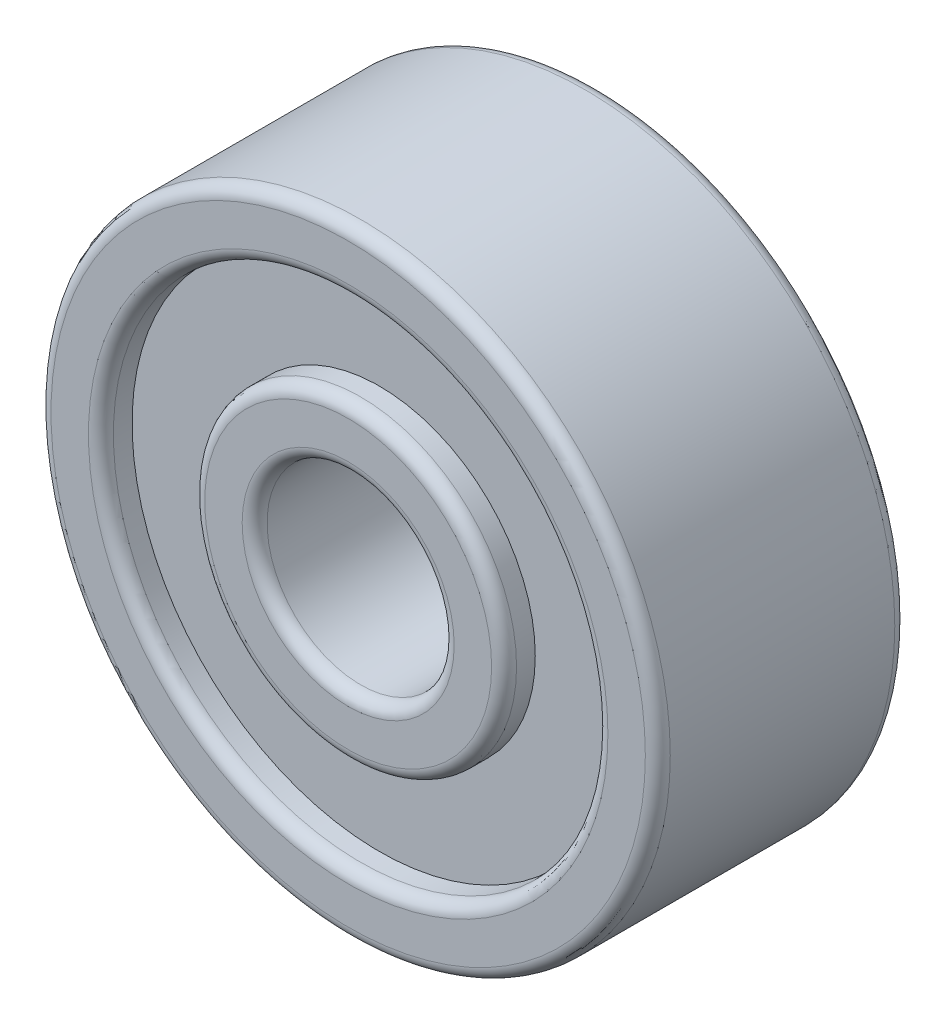
ISO-10303-21;
HEADER;
FILE_DESCRIPTION(('STEP AP214'),'2;1');
FILE_NAME('part.step','',(''),(''),'','','');
FILE_SCHEMA(('AUTOMOTIVE_DESIGN { 1 0 10303 214 1 1 1 1 }'));
ENDSEC;
DATA;
#1=APPLICATION_CONTEXT('core data for automotive mechanical design processes');
#2=APPLICATION_PROTOCOL_DEFINITION('international standard','automotive_design',2000,#1);
#3=PRODUCT_CONTEXT('',#1,'mechanical');
#4=PRODUCT('Part','Part','',(#3));
#5=PRODUCT_RELATED_PRODUCT_CATEGORY('part','',(#4));
#6=PRODUCT_DEFINITION_FORMATION('','',#4);
#7=PRODUCT_DEFINITION_CONTEXT('part definition',#1,'design');
#8=PRODUCT_DEFINITION('design','',#6,#7);
#9=PRODUCT_DEFINITION_SHAPE('','',#8);
#10=(LENGTH_UNIT() NAMED_UNIT(*) SI_UNIT(.MILLI.,.METRE.));
#11=(NAMED_UNIT(*) PLANE_ANGLE_UNIT() SI_UNIT($,.RADIAN.));
#12=(NAMED_UNIT(*) SI_UNIT($,.STERADIAN.) SOLID_ANGLE_UNIT());
#13=UNCERTAINTY_MEASURE_WITH_UNIT(LENGTH_MEASURE(1.E-05),#10,'distance_accuracy_value','');
#14=(GEOMETRIC_REPRESENTATION_CONTEXT(3) GLOBAL_UNCERTAINTY_ASSIGNED_CONTEXT((#13)) GLOBAL_UNIT_ASSIGNED_CONTEXT((#10,
#11,#12)) REPRESENTATION_CONTEXT('',''));
#15=CARTESIAN_POINT('',(0.,0.,0.));
#16=DIRECTION('',(0.,0.,1.));
#17=DIRECTION('',(1.,0.,0.));
#18=AXIS2_PLACEMENT_3D('',#15,#16,#17);
#19=CARTESIAN_POINT('',(0.,0.,2.));
#20=DIRECTION('',(0.,0.,1.));
#21=DIRECTION('',(1.,0.,0.));
#22=AXIS2_PLACEMENT_3D('',#19,#20,#21);
#23=PLANE('',#22);
#24=CARTESIAN_POINT('',(0.,0.,2.));
#25=DIRECTION('',(0.,0.,1.));
#26=DIRECTION('',(1.,0.,0.));
#27=AXIS2_PLACEMENT_3D('',#24,#25,#26);
#28=CIRCLE('',#27,1.7);
#29=CARTESIAN_POINT('',(1.7,0.,2.));
#30=VERTEX_POINT('',#29);
#31=EDGE_CURVE('E55',#30,#30,#28,.F.);
#32=ORIENTED_EDGE('',*,*,#31,.T.);
#33=EDGE_LOOP('',(#32));
#34=FACE_BOUND('',#33,.T.);
#35=CARTESIAN_POINT('',(0.,0.,2.));
#36=DIRECTION('',(0.,0.,1.));
#37=DIRECTION('',(1.,0.,0.));
#38=AXIS2_PLACEMENT_3D('',#35,#36,#37);
#39=CIRCLE('',#38,2.3);
#40=CARTESIAN_POINT('',(2.3,0.,2.));
#41=VERTEX_POINT('',#40);
#42=EDGE_CURVE('E58',#41,#41,#39,.T.);
#43=ORIENTED_EDGE('',*,*,#42,.T.);
#44=EDGE_LOOP('',(#43));
#45=FACE_BOUND('',#44,.T.);
#46=ADVANCED_FACE('F32',(#34,#45),#23,.T.);
#47=CARTESIAN_POINT('',(0.,0.,2.));
#48=DIRECTION('',(0.,0.,1.));
#49=DIRECTION('',(1.,0.,0.));
#50=AXIS2_PLACEMENT_3D('',#47,#48,#49);
#51=CIRCLE('',#50,4.165);
#52=CARTESIAN_POINT('',(4.165,0.,2.));
#53=VERTEX_POINT('',#52);
#54=EDGE_CURVE('E39',#53,#53,#51,.F.);
#55=ORIENTED_EDGE('',*,*,#54,.T.);
#56=EDGE_LOOP('',(#55));
#57=FACE_BOUND('',#56,.T.);
#58=CARTESIAN_POINT('',(0.,0.,2.));
#59=DIRECTION('',(0.,0.,1.));
#60=DIRECTION('',(1.,0.,0.));
#61=AXIS2_PLACEMENT_3D('',#58,#59,#60);
#62=CIRCLE('',#61,4.765);
#63=CARTESIAN_POINT('',(4.765,0.,2.));
#64=VERTEX_POINT('',#63);
#65=EDGE_CURVE('E43',#64,#64,#62,.T.);
#66=ORIENTED_EDGE('',*,*,#65,.T.);
#67=EDGE_LOOP('',(#66));
#68=FACE_BOUND('',#67,.T.);
#69=ADVANCED_FACE('F120',(#57,#68),#23,.T.);
#70=CARTESIAN_POINT('',(0.,0.,2.));
#71=DIRECTION('',(0.,0.,-1.));
#72=DIRECTION('',(-1.,0.,0.));
#73=AXIS2_PLACEMENT_3D('',#70,#71,#72);
#74=CYLINDRICAL_SURFACE('',#73,4.965);
#75=CARTESIAN_POINT('',(0.,0.,1.8));
#76=DIRECTION('',(0.,0.,1.));
#77=DIRECTION('',(1.,0.,0.));
#78=AXIS2_PLACEMENT_3D('',#75,#76,#77);
#79=CIRCLE('',#78,4.965);
#80=CARTESIAN_POINT('',(4.965,0.,1.8));
#81=VERTEX_POINT('',#80);
#82=EDGE_CURVE('E10',#81,#81,#79,.F.);
#83=ORIENTED_EDGE('',*,*,#82,.T.);
#84=EDGE_LOOP('',(#83));
#85=FACE_BOUND('',#84,.T.);
#86=CARTESIAN_POINT('',(0.,0.,-1.8));
#87=DIRECTION('',(0.,0.,1.));
#88=DIRECTION('',(1.,0.,0.));
#89=AXIS2_PLACEMENT_3D('',#86,#87,#88);
#90=CIRCLE('',#89,4.965);
#91=CARTESIAN_POINT('',(4.965,0.,-1.8));
#92=VERTEX_POINT('',#91);
#93=EDGE_CURVE('E70',#92,#92,#90,.F.);
#94=ORIENTED_EDGE('',*,*,#93,.F.);
#95=EDGE_LOOP('',(#94));
#96=FACE_BOUND('',#95,.T.);
#97=ADVANCED_FACE('F126',(#85,#96),#74,.T.);
#98=CARTESIAN_POINT('',(0.,0.,2.));
#99=DIRECTION('',(0.,0.,-1.));
#100=DIRECTION('',(-1.,0.,0.));
#101=AXIS2_PLACEMENT_3D('',#98,#99,#100);
#102=CYLINDRICAL_SURFACE('',#101,1.5);
#103=CARTESIAN_POINT('',(0.,0.,1.8));
#104=DIRECTION('',(0.,0.,1.));
#105=DIRECTION('',(1.,0.,0.));
#106=AXIS2_PLACEMENT_3D('',#103,#104,#105);
#107=CIRCLE('',#106,1.5);
#108=CARTESIAN_POINT('',(1.5,0.,1.8));
#109=VERTEX_POINT('',#108);
#110=EDGE_CURVE('E61',#109,#109,#107,.T.);
#111=ORIENTED_EDGE('',*,*,#110,.T.);
#112=EDGE_LOOP('',(#111));
#113=FACE_BOUND('',#112,.T.);
#114=CARTESIAN_POINT('',(0.,0.,-1.8));
#115=DIRECTION('',(0.,0.,1.));
#116=DIRECTION('',(1.,0.,0.));
#117=AXIS2_PLACEMENT_3D('',#114,#115,#116);
#118=CIRCLE('',#117,1.5);
#119=CARTESIAN_POINT('',(1.5,0.,-1.8));
#120=VERTEX_POINT('',#119);
#121=EDGE_CURVE('E91',#120,#120,#118,.T.);
#122=ORIENTED_EDGE('',*,*,#121,.F.);
#123=EDGE_LOOP('',(#122));
#124=FACE_BOUND('',#123,.T.);
#125=ADVANCED_FACE('F130',(#113,#124),#102,.F.);
#126=CARTESIAN_POINT('',(0.,0.,1.5));
#127=DIRECTION('',(0.,0.,1.));
#128=DIRECTION('',(1.,0.,0.));
#129=AXIS2_PLACEMENT_3D('',#126,#127,#128);
#130=CYLINDRICAL_SURFACE('',#129,3.965);
#131=CARTESIAN_POINT('',(0.,0.,1.8));
#132=DIRECTION('',(0.,0.,1.));
#133=DIRECTION('',(1.,0.,0.));
#134=AXIS2_PLACEMENT_3D('',#131,#132,#133);
#135=CIRCLE('',#134,3.965);
#136=CARTESIAN_POINT('',(3.965,0.,1.8));
#137=VERTEX_POINT('',#136);
#138=EDGE_CURVE('E47',#137,#137,#135,.T.);
#139=ORIENTED_EDGE('',*,*,#138,.T.);
#140=EDGE_LOOP('',(#139));
#141=FACE_BOUND('',#140,.T.);
#142=CARTESIAN_POINT('',(0.,0.,1.5));
#143=DIRECTION('',(0.,0.,1.));
#144=DIRECTION('',(1.,0.,0.));
#145=AXIS2_PLACEMENT_3D('',#142,#143,#144);
#146=CIRCLE('',#145,3.965);
#147=CARTESIAN_POINT('',(3.965,0.,1.5));
#148=VERTEX_POINT('',#147);
#149=EDGE_CURVE('E64',#148,#148,#146,.T.);
#150=ORIENTED_EDGE('',*,*,#149,.F.);
#151=EDGE_LOOP('',(#150));
#152=FACE_BOUND('',#151,.T.);
#153=ADVANCED_FACE('F153',(#141,#152),#130,.F.);
#154=CARTESIAN_POINT('',(0.,0.,1.5));
#155=DIRECTION('',(0.,0.,1.));
#156=DIRECTION('',(1.,0.,0.));
#157=AXIS2_PLACEMENT_3D('',#154,#155,#156);
#158=PLANE('',#157);
#159=CARTESIAN_POINT('',(0.,0.,1.5));
#160=DIRECTION('',(0.,0.,1.));
#161=DIRECTION('',(1.,0.,0.));
#162=AXIS2_PLACEMENT_3D('',#159,#160,#161);
#163=CIRCLE('',#162,2.5);
#164=CARTESIAN_POINT('',(2.5,0.,1.5));
#165=VERTEX_POINT('',#164);
#166=EDGE_CURVE('E67',#165,#165,#163,.T.);
#167=ORIENTED_EDGE('',*,*,#166,.F.);
#168=EDGE_LOOP('',(#167));
#169=FACE_BOUND('',#168,.T.);
#170=ORIENTED_EDGE('',*,*,#149,.T.);
#171=EDGE_LOOP('',(#170));
#172=FACE_BOUND('',#171,.T.);
#173=ADVANCED_FACE('F156',(#169,#172),#158,.T.);
#174=CARTESIAN_POINT('',(0.,0.,1.5));
#175=DIRECTION('',(0.,0.,1.));
#176=DIRECTION('',(1.,0.,0.));
#177=AXIS2_PLACEMENT_3D('',#174,#175,#176);
#178=CYLINDRICAL_SURFACE('',#177,2.5);
#179=CARTESIAN_POINT('',(0.,0.,1.8));
#180=DIRECTION('',(0.,0.,1.));
#181=DIRECTION('',(1.,0.,0.));
#182=AXIS2_PLACEMENT_3D('',#179,#180,#181);
#183=CIRCLE('',#182,2.5);
#184=CARTESIAN_POINT('',(2.5,0.,1.8));
#185=VERTEX_POINT('',#184);
#186=EDGE_CURVE('E52',#185,#185,#183,.F.);
#187=ORIENTED_EDGE('',*,*,#186,.T.);
#188=EDGE_LOOP('',(#187));
#189=FACE_BOUND('',#188,.T.);
#190=ORIENTED_EDGE('',*,*,#166,.T.);
#191=EDGE_LOOP('',(#190));
#192=FACE_BOUND('',#191,.T.);
#193=ADVANCED_FACE('F138',(#189,#192),#178,.T.);
#194=CARTESIAN_POINT('',(0.,0.,1.8));
#195=DIRECTION('',(0.,0.,1.));
#196=DIRECTION('',(1.,0.,0.));
#197=AXIS2_PLACEMENT_3D('',#194,#195,#196);
#198=TOROIDAL_SURFACE('',#197,1.7,0.2);
#199=ORIENTED_EDGE('',*,*,#31,.F.);
#200=EDGE_LOOP('',(#199));
#201=FACE_BOUND('',#200,.T.);
#202=ORIENTED_EDGE('',*,*,#110,.F.);
#203=EDGE_LOOP('',(#202));
#204=FACE_BOUND('',#203,.T.);
#205=ADVANCED_FACE('F134',(#201,#204),#198,.T.);
#206=CARTESIAN_POINT('',(0.,0.,1.8));
#207=DIRECTION('',(0.,0.,1.));
#208=DIRECTION('',(1.,0.,0.));
#209=AXIS2_PLACEMENT_3D('',#206,#207,#208);
#210=TOROIDAL_SURFACE('',#209,2.3,0.2);
#211=ORIENTED_EDGE('',*,*,#186,.F.);
#212=EDGE_LOOP('',(#211));
#213=FACE_BOUND('',#212,.T.);
#214=ORIENTED_EDGE('',*,*,#42,.F.);
#215=EDGE_LOOP('',(#214));
#216=FACE_BOUND('',#215,.T.);
#217=ADVANCED_FACE('F137',(#213,#216),#210,.T.);
#218=CARTESIAN_POINT('',(0.,0.,1.8));
#219=DIRECTION('',(0.,0.,1.));
#220=DIRECTION('',(1.,0.,0.));
#221=AXIS2_PLACEMENT_3D('',#218,#219,#220);
#222=TOROIDAL_SURFACE('',#221,4.165,0.2);
#223=ORIENTED_EDGE('',*,*,#54,.F.);
#224=EDGE_LOOP('',(#223));
#225=FACE_BOUND('',#224,.T.);
#226=ORIENTED_EDGE('',*,*,#138,.F.);
#227=EDGE_LOOP('',(#226));
#228=FACE_BOUND('',#227,.T.);
#229=ADVANCED_FACE('F141',(#225,#228),#222,.T.);
#230=CARTESIAN_POINT('',(0.,0.,1.8));
#231=DIRECTION('',(0.,0.,1.));
#232=DIRECTION('',(1.,0.,0.));
#233=AXIS2_PLACEMENT_3D('',#230,#231,#232);
#234=TOROIDAL_SURFACE('',#233,4.765,0.2);
#235=ORIENTED_EDGE('',*,*,#82,.F.);
#236=EDGE_LOOP('',(#235));
#237=FACE_BOUND('',#236,.T.);
#238=ORIENTED_EDGE('',*,*,#65,.F.);
#239=EDGE_LOOP('',(#238));
#240=FACE_BOUND('',#239,.T.);
#241=ADVANCED_FACE('F34',(#237,#240),#234,.T.);
#242=CARTESIAN_POINT('',(0.,0.,-2.));
#243=DIRECTION('',(0.,0.,-1.));
#244=DIRECTION('',(1.,0.,0.));
#245=AXIS2_PLACEMENT_3D('',#242,#243,#244);
#246=PLANE('',#245);
#247=CARTESIAN_POINT('',(0.,0.,-2.));
#248=DIRECTION('',(0.,0.,1.));
#249=DIRECTION('',(1.,0.,0.));
#250=AXIS2_PLACEMENT_3D('',#247,#248,#249);
#251=CIRCLE('',#250,1.7);
#252=CARTESIAN_POINT('',(1.7,0.,-2.));
#253=VERTEX_POINT('',#252);
#254=EDGE_CURVE('E85',#253,#253,#251,.F.);
#255=ORIENTED_EDGE('',*,*,#254,.F.);
#256=EDGE_LOOP('',(#255));
#257=FACE_BOUND('',#256,.T.);
#258=CARTESIAN_POINT('',(0.,0.,-2.));
#259=DIRECTION('',(0.,0.,1.));
#260=DIRECTION('',(1.,0.,0.));
#261=AXIS2_PLACEMENT_3D('',#258,#259,#260);
#262=CIRCLE('',#261,2.3);
#263=CARTESIAN_POINT('',(2.3,0.,-2.));
#264=VERTEX_POINT('',#263);
#265=EDGE_CURVE('E88',#264,#264,#262,.T.);
#266=ORIENTED_EDGE('',*,*,#265,.F.);
#267=EDGE_LOOP('',(#266));
#268=FACE_BOUND('',#267,.T.);
#269=ADVANCED_FACE('F148',(#257,#268),#246,.T.);
#270=CARTESIAN_POINT('',(0.,0.,-2.));
#271=DIRECTION('',(0.,0.,1.));
#272=DIRECTION('',(1.,0.,0.));
#273=AXIS2_PLACEMENT_3D('',#270,#271,#272);
#274=CIRCLE('',#273,4.165);
#275=CARTESIAN_POINT('',(4.165,0.,-2.));
#276=VERTEX_POINT('',#275);
#277=EDGE_CURVE('E73',#276,#276,#274,.F.);
#278=ORIENTED_EDGE('',*,*,#277,.F.);
#279=EDGE_LOOP('',(#278));
#280=FACE_BOUND('',#279,.T.);
#281=CARTESIAN_POINT('',(0.,0.,-2.));
#282=DIRECTION('',(0.,0.,1.));
#283=DIRECTION('',(1.,0.,0.));
#284=AXIS2_PLACEMENT_3D('',#281,#282,#283);
#285=CIRCLE('',#284,4.765);
#286=CARTESIAN_POINT('',(4.765,0.,-2.));
#287=VERTEX_POINT('',#286);
#288=EDGE_CURVE('E76',#287,#287,#285,.T.);
#289=ORIENTED_EDGE('',*,*,#288,.F.);
#290=EDGE_LOOP('',(#289));
#291=FACE_BOUND('',#290,.T.);
#292=ADVANCED_FACE('F180',(#280,#291),#246,.T.);
#293=CARTESIAN_POINT('',(0.,0.,-1.5));
#294=DIRECTION('',(0.,0.,-1.));
#295=DIRECTION('',(1.,0.,0.));
#296=AXIS2_PLACEMENT_3D('',#293,#294,#295);
#297=CYLINDRICAL_SURFACE('',#296,3.965);
#298=CARTESIAN_POINT('',(0.,0.,-1.8));
#299=DIRECTION('',(0.,0.,1.));
#300=DIRECTION('',(1.,0.,0.));
#301=AXIS2_PLACEMENT_3D('',#298,#299,#300);
#302=CIRCLE('',#301,3.965);
#303=CARTESIAN_POINT('',(3.965,0.,-1.8));
#304=VERTEX_POINT('',#303);
#305=EDGE_CURVE('E79',#304,#304,#302,.T.);
#306=ORIENTED_EDGE('',*,*,#305,.F.);
#307=EDGE_LOOP('',(#306));
#308=FACE_BOUND('',#307,.T.);
#309=CARTESIAN_POINT('',(0.,0.,-1.5));
#310=DIRECTION('',(0.,0.,1.));
#311=DIRECTION('',(1.,0.,0.));
#312=AXIS2_PLACEMENT_3D('',#309,#310,#311);
#313=CIRCLE('',#312,3.965);
#314=CARTESIAN_POINT('',(3.965,0.,-1.5));
#315=VERTEX_POINT('',#314);
#316=EDGE_CURVE('E94',#315,#315,#313,.T.);
#317=ORIENTED_EDGE('',*,*,#316,.T.);
#318=EDGE_LOOP('',(#317));
#319=FACE_BOUND('',#318,.T.);
#320=ADVANCED_FACE('F116',(#308,#319),#297,.F.);
#321=CARTESIAN_POINT('',(0.,0.,-1.5));
#322=DIRECTION('',(0.,0.,-1.));
#323=DIRECTION('',(1.,0.,0.));
#324=AXIS2_PLACEMENT_3D('',#321,#322,#323);
#325=PLANE('',#324);
#326=CARTESIAN_POINT('',(0.,0.,-1.5));
#327=DIRECTION('',(0.,0.,1.));
#328=DIRECTION('',(1.,0.,0.));
#329=AXIS2_PLACEMENT_3D('',#326,#327,#328);
#330=CIRCLE('',#329,2.5);
#331=CARTESIAN_POINT('',(2.5,0.,-1.5));
#332=VERTEX_POINT('',#331);
#333=EDGE_CURVE('E97',#332,#332,#330,.T.);
#334=ORIENTED_EDGE('',*,*,#333,.T.);
#335=EDGE_LOOP('',(#334));
#336=FACE_BOUND('',#335,.T.);
#337=ORIENTED_EDGE('',*,*,#316,.F.);
#338=EDGE_LOOP('',(#337));
#339=FACE_BOUND('',#338,.T.);
#340=ADVANCED_FACE('F101',(#336,#339),#325,.T.);
#341=CARTESIAN_POINT('',(0.,0.,-1.5));
#342=DIRECTION('',(0.,0.,-1.));
#343=DIRECTION('',(1.,0.,0.));
#344=AXIS2_PLACEMENT_3D('',#341,#342,#343);
#345=CYLINDRICAL_SURFACE('',#344,2.5);
#346=CARTESIAN_POINT('',(0.,0.,-1.8));
#347=DIRECTION('',(0.,0.,1.));
#348=DIRECTION('',(1.,0.,0.));
#349=AXIS2_PLACEMENT_3D('',#346,#347,#348);
#350=CIRCLE('',#349,2.5);
#351=CARTESIAN_POINT('',(2.5,0.,-1.8));
#352=VERTEX_POINT('',#351);
#353=EDGE_CURVE('E82',#352,#352,#350,.F.);
#354=ORIENTED_EDGE('',*,*,#353,.F.);
#355=EDGE_LOOP('',(#354));
#356=FACE_BOUND('',#355,.T.);
#357=ORIENTED_EDGE('',*,*,#333,.F.);
#358=EDGE_LOOP('',(#357));
#359=FACE_BOUND('',#358,.T.);
#360=ADVANCED_FACE('F104',(#356,#359),#345,.T.);
#361=CARTESIAN_POINT('',(0.,0.,-1.8));
#362=DIRECTION('',(0.,0.,-1.));
#363=DIRECTION('',(1.,0.,0.));
#364=AXIS2_PLACEMENT_3D('',#361,#362,#363);
#365=TOROIDAL_SURFACE('',#364,1.7,0.2);
#366=ORIENTED_EDGE('',*,*,#254,.T.);
#367=EDGE_LOOP('',(#366));
#368=FACE_BOUND('',#367,.T.);
#369=ORIENTED_EDGE('',*,*,#121,.T.);
#370=EDGE_LOOP('',(#369));
#371=FACE_BOUND('',#370,.T.);
#372=ADVANCED_FACE('F106',(#368,#371),#365,.T.);
#373=CARTESIAN_POINT('',(0.,0.,-1.8));
#374=DIRECTION('',(0.,0.,-1.));
#375=DIRECTION('',(1.,0.,0.));
#376=AXIS2_PLACEMENT_3D('',#373,#374,#375);
#377=TOROIDAL_SURFACE('',#376,2.3,0.2);
#378=ORIENTED_EDGE('',*,*,#353,.T.);
#379=EDGE_LOOP('',(#378));
#380=FACE_BOUND('',#379,.T.);
#381=ORIENTED_EDGE('',*,*,#265,.T.);
#382=EDGE_LOOP('',(#381));
#383=FACE_BOUND('',#382,.T.);
#384=ADVANCED_FACE('F113',(#380,#383),#377,.T.);
#385=CARTESIAN_POINT('',(0.,0.,-1.8));
#386=DIRECTION('',(0.,0.,-1.));
#387=DIRECTION('',(1.,0.,0.));
#388=AXIS2_PLACEMENT_3D('',#385,#386,#387);
#389=TOROIDAL_SURFACE('',#388,4.165,0.2);
#390=ORIENTED_EDGE('',*,*,#277,.T.);
#391=EDGE_LOOP('',(#390));
#392=FACE_BOUND('',#391,.T.);
#393=ORIENTED_EDGE('',*,*,#305,.T.);
#394=EDGE_LOOP('',(#393));
#395=FACE_BOUND('',#394,.T.);
#396=ADVANCED_FACE('F172',(#392,#395),#389,.T.);
#397=CARTESIAN_POINT('',(0.,0.,-1.8));
#398=DIRECTION('',(0.,0.,-1.));
#399=DIRECTION('',(1.,0.,0.));
#400=AXIS2_PLACEMENT_3D('',#397,#398,#399);
#401=TOROIDAL_SURFACE('',#400,4.765,0.2);
#402=ORIENTED_EDGE('',*,*,#93,.T.);
#403=EDGE_LOOP('',(#402));
#404=FACE_BOUND('',#403,.T.);
#405=ORIENTED_EDGE('',*,*,#288,.T.);
#406=EDGE_LOOP('',(#405));
#407=FACE_BOUND('',#406,.T.);
#408=ADVANCED_FACE('F169',(#404,#407),#401,.T.);
#409=CLOSED_SHELL('',(#46,#69,#97,#125,#153,#173,#193,#205,#217,#229,#241,#269,#292,#320,#340,
#360,#372,#384,#396,#408));
#410=MANIFOLD_SOLID_BREP('B2',#409);
#411=ADVANCED_BREP_SHAPE_REPRESENTATION('',(#18,#410),#14);
#412=SHAPE_DEFINITION_REPRESENTATION(#9,#411);
ENDSEC;
END-ISO-10303-21;
